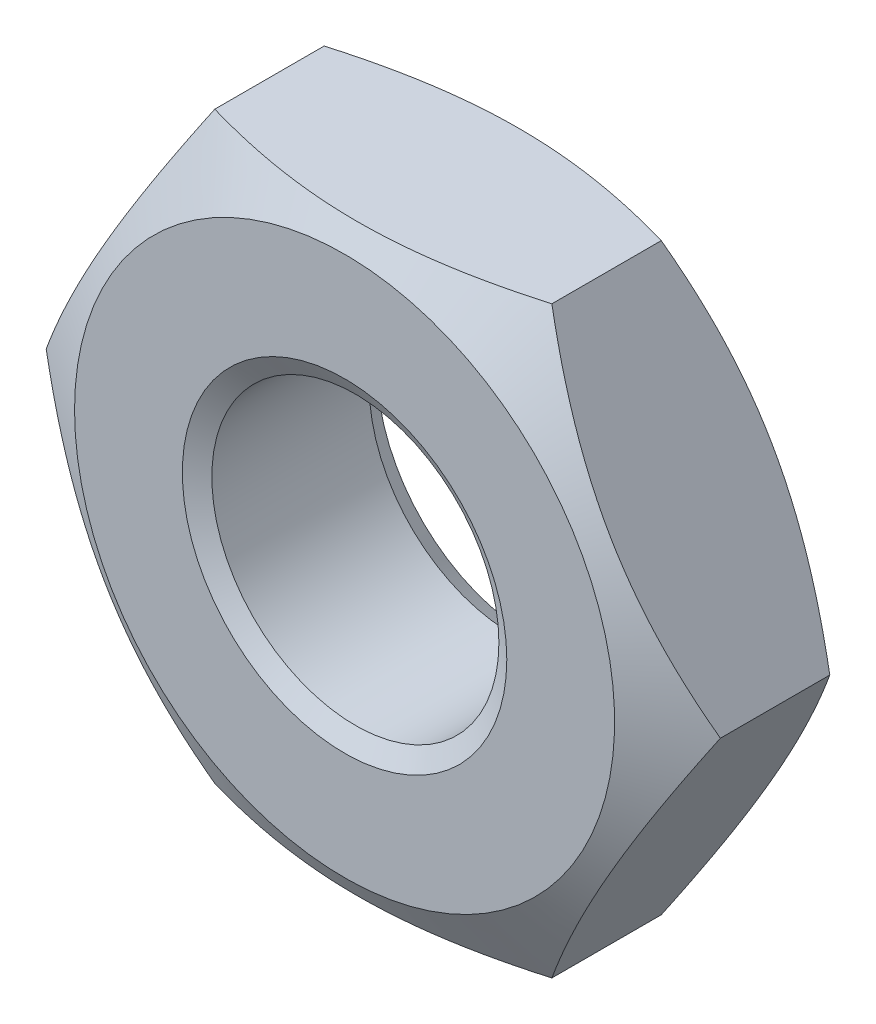
ISO-10303-21;
HEADER;
FILE_DESCRIPTION(('STEP AP214'),'2;1');
FILE_NAME('part.step','',(''),(''),'','','');
FILE_SCHEMA(('AUTOMOTIVE_DESIGN { 1 0 10303 214 1 1 1 1 }'));
ENDSEC;
DATA;
#1=APPLICATION_CONTEXT('core data for automotive mechanical design processes');
#2=APPLICATION_PROTOCOL_DEFINITION('international standard','automotive_design',2000,#1);
#3=PRODUCT_CONTEXT('',#1,'mechanical');
#4=PRODUCT('Part','Part','',(#3));
#5=PRODUCT_RELATED_PRODUCT_CATEGORY('part','',(#4));
#6=PRODUCT_DEFINITION_FORMATION('','',#4);
#7=PRODUCT_DEFINITION_CONTEXT('part definition',#1,'design');
#8=PRODUCT_DEFINITION('design','',#6,#7);
#9=PRODUCT_DEFINITION_SHAPE('','',#8);
#10=(LENGTH_UNIT() NAMED_UNIT(*) SI_UNIT(.MILLI.,.METRE.));
#11=(NAMED_UNIT(*) PLANE_ANGLE_UNIT() SI_UNIT($,.RADIAN.));
#12=(NAMED_UNIT(*) SI_UNIT($,.STERADIAN.) SOLID_ANGLE_UNIT());
#13=UNCERTAINTY_MEASURE_WITH_UNIT(LENGTH_MEASURE(1.E-05),#10,'distance_accuracy_value','');
#14=(GEOMETRIC_REPRESENTATION_CONTEXT(3) GLOBAL_UNCERTAINTY_ASSIGNED_CONTEXT((#13)) GLOBAL_UNIT_ASSIGNED_CONTEXT((#10,
#11,#12)) REPRESENTATION_CONTEXT('',''));
#15=CARTESIAN_POINT('',(0.,0.,0.));
#16=DIRECTION('',(0.,0.,1.));
#17=DIRECTION('',(1.,0.,0.));
#18=AXIS2_PLACEMENT_3D('',#15,#16,#17);
#19=CARTESIAN_POINT('',(-2.88675134594813,-5.,-3.2));
#20=DIRECTION('',(0.,-1.,0.));
#21=DIRECTION('',(0.,0.,-1.));
#22=AXIS2_PLACEMENT_3D('',#19,#20,#21);
#23=PLANE('',#22);
#24=CARTESIAN_POINT('',(-7.62610109642657,-5.,-2.59465189961733));
#25=CARTESIAN_POINT('',(-7.40680462387157,-5.,-2.48880064655454));
#26=CARTESIAN_POINT('',(-7.18698625319056,-5.,-2.38401087554829));
#27=CARTESIAN_POINT('',(-6.74602337963763,-5.,-2.17716157604716));
#28=CARTESIAN_POINT('',(-6.5248786519794,-5.,-2.07510252732497));
#29=CARTESIAN_POINT('',(-6.07977122145086,-5.,-1.87377772298819));
#30=CARTESIAN_POINT('',(-5.85579961499066,-5.,-1.7745315804738));
#31=CARTESIAN_POINT('',(-5.40600442176888,-5.,-1.58034558991326));
#32=CARTESIAN_POINT('',(-5.18018093332123,-5.,-1.48540551498912));
#33=CARTESIAN_POINT('',(-4.72365957742319,-5.,-1.29990810802235));
#34=CARTESIAN_POINT('',(-4.49293557407722,-5.,-1.20941474238578));
#35=CARTESIAN_POINT('',(-4.0287555357453,-5.,-1.03559062317218));
#36=CARTESIAN_POINT('',(-3.79529919900584,-5.,-0.952260669352543));
#37=CARTESIAN_POINT('',(-3.32577267957494,-5.,-0.795024367942579));
#38=CARTESIAN_POINT('',(-3.08970936568518,-5.,-0.72109772056705));
#39=CARTESIAN_POINT('',(-2.61422832862103,-5.,-0.585088280679049));
#40=CARTESIAN_POINT('',(-2.37481170005248,-5.,-0.523001715725235));
#41=CARTESIAN_POINT('',(-1.8924485677613,-5.,-0.413702737543139));
#42=CARTESIAN_POINT('',(-1.64950078161835,-5.,-0.366495876945354));
#43=CARTESIAN_POINT('',(-1.16070996598629,-5.,-0.29016024394961));
#44=CARTESIAN_POINT('',(-0.914866928294789,-5.,-0.261031522780502));
#45=CARTESIAN_POINT('',(-0.423107003526087,-5.,-0.223429734101214));
#46=CARTESIAN_POINT('',(-0.17720012837845,-5.,-0.21482904798375));
#47=CARTESIAN_POINT('',(0.314391860281712,-5.,-0.218726959851281));
#48=CARTESIAN_POINT('',(0.560077014096603,-5.,-0.231220233916041));
#49=CARTESIAN_POINT('',(0.98046823291688,-5.,-0.26977191210304));
#50=CARTESIAN_POINT('',(1.15564068945729,-5.,-0.291007824000625));
#51=CARTESIAN_POINT('',(1.50461161321748,-5.,-0.342806673261787));
#52=CARTESIAN_POINT('',(1.67840986865902,-5.,-0.373371020558309));
#53=CARTESIAN_POINT('',(2.19802325603685,-5.,-0.477533886990483));
#54=CARTESIAN_POINT('',(2.54137550131329,-5.,-0.563531808073422));
#55=CARTESIAN_POINT('',(3.05491771823626,-5.,-0.711561468799111));
#56=CARTESIAN_POINT('',(3.22779534181989,-5.,-0.764790949484559));
#57=CARTESIAN_POINT('',(3.57188016810636,-5.,-0.876495029428237));
#58=CARTESIAN_POINT('',(3.74308721989283,-5.,-0.934970097787195));
#59=CARTESIAN_POINT('',(4.08297609926363,-5.,-1.05591692981487));
#60=CARTESIAN_POINT('',(4.2516667366709,-5.,-1.11836418481148));
#61=CARTESIAN_POINT('',(4.58761682064633,-5.,-1.24683492900998));
#62=CARTESIAN_POINT('',(4.75487673996794,-5.,-1.3128571795353));
#63=CARTESIAN_POINT('',(4.92153493264753,-5.,-1.38033134642848));
#64=B_SPLINE_CURVE_WITH_KNOTS('',3,(#24,#25,#26,#27,#28,#29,#30,#31,#32,#33,#34,#35,#36,#37,#38,
#39,#40,#41,#42,#43,#44,#45,#46,#47,#48,#49,#50,#51,#52,#53,#54,#55,#56,#57,#58,#59,#60,#61,#62,
#63),.UNSPECIFIED.,.F.,.F.,(4,2,2,2,2,2,2,2,2,2,2,2,2,2,2,2,2,2,2,4),(0.,0.73052956672456,
1.46118665165218,2.19607764026717,2.93092986387477,3.67434556130395,4.41784414969813,
5.15970940795047,5.90133789959201,6.64324281655146,7.38514983587115,8.12243241795256,
8.85952894455192,9.38863514952208,9.9178213651246,10.9782399869672,11.5208585190153,
12.0635256246456,12.6031195929073,13.1425277824729),.UNSPECIFIED.);
#65=CARTESIAN_POINT('',(-2.88675134594813,-5.00000000000001,-0.663088338331307));
#66=VERTEX_POINT('',#65);
#67=CARTESIAN_POINT('',(2.88675134594813,-5.,-0.663088338331307));
#68=VERTEX_POINT('',#67);
#69=EDGE_CURVE('E50',#66,#68,#64,.T.);
#70=ORIENTED_EDGE('',*,*,#69,.F.);
#71=DIRECTION('',(0.,0.,1.));
#72=VECTOR('',#71,1.);
#73=CARTESIAN_POINT('',(-2.88675134594813,-5.,-3.2));
#74=LINE('',#73,#72);
#75=CARTESIAN_POINT('',(-2.88675134594813,-5.00000000000001,-2.53691166166869));
#76=VERTEX_POINT('',#75);
#77=EDGE_CURVE('E105',#76,#66,#74,.T.);
#78=ORIENTED_EDGE('',*,*,#77,.F.);
#79=CARTESIAN_POINT('',(-7.62610109642657,-5.,-0.60534810038267));
#80=CARTESIAN_POINT('',(-7.40680462387157,-5.,-0.71119935344546));
#81=CARTESIAN_POINT('',(-7.18698625319056,-5.,-0.81598912445171));
#82=CARTESIAN_POINT('',(-6.74602337963764,-5.,-1.02283842395284));
#83=CARTESIAN_POINT('',(-6.5248786519794,-5.,-1.12489747267503));
#84=CARTESIAN_POINT('',(-6.07977122145087,-5.,-1.32622227701181));
#85=CARTESIAN_POINT('',(-5.85579961499066,-5.,-1.4254684195262));
#86=CARTESIAN_POINT('',(-5.40600442176889,-5.,-1.61965441008674));
#87=CARTESIAN_POINT('',(-5.18018093332123,-5.,-1.71459448501088));
#88=CARTESIAN_POINT('',(-4.7236595774232,-5.,-1.90009189197765));
#89=CARTESIAN_POINT('',(-4.49293557407722,-5.,-1.99058525761422));
#90=CARTESIAN_POINT('',(-4.02875553574531,-5.,-2.16440937682782));
#91=CARTESIAN_POINT('',(-3.79529919900584,-5.,-2.24773933064746));
#92=CARTESIAN_POINT('',(-3.32577267957494,-5.,-2.40497563205742));
#93=CARTESIAN_POINT('',(-3.08970936568518,-5.,-2.47890227943295));
#94=CARTESIAN_POINT('',(-2.61422832862103,-5.,-2.61491171932095));
#95=CARTESIAN_POINT('',(-2.37481170005248,-5.,-2.67699828427477));
#96=CARTESIAN_POINT('',(-1.8924485677613,-5.,-2.78629726245686));
#97=CARTESIAN_POINT('',(-1.64950078161835,-5.,-2.83350412305465));
#98=CARTESIAN_POINT('',(-1.16070996598629,-5.,-2.90983975605039));
#99=CARTESIAN_POINT('',(-0.914866928294789,-5.,-2.9389684772195));
#100=CARTESIAN_POINT('',(-0.423107003526086,-5.,-2.97657026589879));
#101=CARTESIAN_POINT('',(-0.17720012837845,-5.,-2.98517095201625));
#102=CARTESIAN_POINT('',(0.314391860281713,-5.,-2.98127304014872));
#103=CARTESIAN_POINT('',(0.560077014096603,-5.,-2.96877976608396));
#104=CARTESIAN_POINT('',(0.98046823291688,-5.,-2.93022808789696));
#105=CARTESIAN_POINT('',(1.15564068945728,-5.,-2.90899217599938));
#106=CARTESIAN_POINT('',(1.50461161321748,-5.,-2.85719332673821));
#107=CARTESIAN_POINT('',(1.67840986865902,-5.,-2.82662897944169));
#108=CARTESIAN_POINT('',(2.19802325603684,-5.,-2.72246611300952));
#109=CARTESIAN_POINT('',(2.54137550131329,-5.,-2.63646819192658));
#110=CARTESIAN_POINT('',(3.05491771823626,-5.,-2.48843853120089));
#111=CARTESIAN_POINT('',(3.22779534181988,-5.,-2.43520905051544));
#112=CARTESIAN_POINT('',(3.57188016810636,-5.,-2.32350497057176));
#113=CARTESIAN_POINT('',(3.74308721989283,-5.,-2.26502990221281));
#114=CARTESIAN_POINT('',(4.08297609926363,-5.,-2.14408307018513));
#115=CARTESIAN_POINT('',(4.2516667366709,-5.,-2.08163581518852));
#116=CARTESIAN_POINT('',(4.58761682064633,-5.,-1.95316507099002));
#117=CARTESIAN_POINT('',(4.75487673996794,-5.,-1.8871428204647));
#118=CARTESIAN_POINT('',(4.92153493264753,-5.,-1.81966865357152));
#119=B_SPLINE_CURVE_WITH_KNOTS('',3,(#79,#80,#81,#82,#83,#84,#85,#86,#87,#88,#89,#90,#91,#92,
#93,#94,#95,#96,#97,#98,#99,#100,#101,#102,#103,#104,#105,#106,#107,#108,#109,#110,#111,#112,
#113,#114,#115,#116,#117,#118),.UNSPECIFIED.,.F.,.F.,(4,2,2,2,2,2,2,2,2,2,2,2,2,2,2,2,2,2,2,4),
(0.,0.730529566724558,1.46118665165218,2.19607764026716,2.93092986387477,3.67434556130395,
4.41784414969813,5.15970940795047,5.90133789959201,6.64324281655146,7.38514983587115,
8.12243241795256,8.85952894455192,9.38863514952208,9.9178213651246,10.9782399869672,
11.5208585190152,12.0635256246456,12.6031195929073,13.1425277824729),.UNSPECIFIED.);
#120=CARTESIAN_POINT('',(2.88675134594813,-5.00000000000001,-2.53691166166869));
#121=VERTEX_POINT('',#120);
#122=EDGE_CURVE('E126',#121,#76,#119,.F.);
#123=ORIENTED_EDGE('',*,*,#122,.F.);
#124=DIRECTION('',(0.,0.,1.));
#125=VECTOR('',#124,1.);
#126=CARTESIAN_POINT('',(2.88675134594813,-5.,-3.2));
#127=LINE('',#126,#125);
#128=EDGE_CURVE('E123',#121,#68,#127,.T.);
#129=ORIENTED_EDGE('',*,*,#128,.T.);
#130=EDGE_LOOP('',(#70,#78,#123,#129));
#131=FACE_BOUND('',#130,.T.);
#132=ADVANCED_FACE('F35',(#131),#23,.T.);
#133=CARTESIAN_POINT('',(-5.77350269189626,0.,-3.2));
#134=DIRECTION('',(-0.866025403784438,-0.5,0.));
#135=DIRECTION('',(0.5,-0.866025403784438,0.));
#136=AXIS2_PLACEMENT_3D('',#133,#134,#135);
#137=PLANE('',#136);
#138=CARTESIAN_POINT('',(-5.7736181619501,0.000200000000000997,-0.663155006997934));
#139=CARTESIAN_POINT('',(-5.64675433465071,-0.219534594525183,-0.589892918583741));
#140=CARTESIAN_POINT('',(-5.5188054379059,-0.441148584459579,-0.523257672864198));
#141=CARTESIAN_POINT('',(-5.26069210252318,-0.888213995453511,-0.406945341956918));
#142=CARTESIAN_POINT('',(-5.13052307794721,-1.11367335959077,-0.357309400861896));
#143=CARTESIAN_POINT('',(-4.87177839004641,-1.56183230522351,-0.280057376364806));
#144=CARTESIAN_POINT('',(-4.74324302208387,-1.78446209310419,-0.251926729229598));
#145=CARTESIAN_POINT('',(-4.54998783160116,-2.11918990184664,-0.226701272899793));
#146=CARTESIAN_POINT('',(-4.48552534905128,-2.23084219680506,-0.221119810715592));
#147=CARTESIAN_POINT('',(-4.35654081066911,-2.4542499706738,-0.215708567697578));
#148=CARTESIAN_POINT('',(-4.2920187567385,-2.56600544629031,-0.215878609204312));
#149=CARTESIAN_POINT('',(-4.11524635305245,-2.87218423085064,-0.224259982738145));
#150=CARTESIAN_POINT('',(-4.00305457769146,-3.06650608596721,-0.23833612284336));
#151=CARTESIAN_POINT('',(-3.77941563226458,-3.4538601019977,-0.282971608055538));
#152=CARTESIAN_POINT('',(-3.66796924828419,-3.64689090137157,-0.313546211093615));
#153=CARTESIAN_POINT('',(-3.44387972423144,-4.03502534247485,-0.389974844567269));
#154=CARTESIAN_POINT('',(-3.3312648659868,-4.23007999864173,-0.436152729824785));
#155=CARTESIAN_POINT('',(-3.10771464157941,-4.61728034535877,-0.540958145438038));
#156=CARTESIAN_POINT('',(-2.99677641204847,-4.80943099540808,-0.599561054383478));
#157=CARTESIAN_POINT('',(-2.88663587589429,-5.0002,-0.663155006997931));
#158=B_SPLINE_CURVE_WITH_KNOTS('',3,(#138,#139,#140,#141,#142,#143,#144,#145,#146,#147,#148,
#149,#150,#151,#152,#153,#154,#155,#156,#157),.UNSPECIFIED.,.F.,.F.,(4,2,2,2,2,2,2,2,2,4),(0.,
0.79255584136309,1.58701660053333,2.3618153748728,2.74884076077325,3.13585419177295,
3.80962362599679,4.48401723901189,5.17336882348928,5.86136694793725),.UNSPECIFIED.);
#159=CARTESIAN_POINT('',(-5.77350269189626,0.,-0.663088338331307));
#160=VERTEX_POINT('',#159);
#161=EDGE_CURVE('E90',#160,#66,#158,.T.);
#162=ORIENTED_EDGE('',*,*,#161,.F.);
#163=DIRECTION('',(0.,0.,1.));
#164=VECTOR('',#163,1.);
#165=CARTESIAN_POINT('',(-5.77350269189626,0.,-3.2));
#166=LINE('',#165,#164);
#167=CARTESIAN_POINT('',(-5.77350269189626,0.,-2.53691166166869));
#168=VERTEX_POINT('',#167);
#169=EDGE_CURVE('E103',#168,#160,#166,.T.);
#170=ORIENTED_EDGE('',*,*,#169,.F.);
#171=CARTESIAN_POINT('',(-2.88663587589429,-5.0002,-2.53684499300207));
#172=CARTESIAN_POINT('',(-3.01349970319368,-4.78046540547481,-2.61010708141626));
#173=CARTESIAN_POINT('',(-3.14144859993849,-4.55885141554042,-2.6767423271358));
#174=CARTESIAN_POINT('',(-3.39956193532121,-4.11178600454649,-2.79305465804308));
#175=CARTESIAN_POINT('',(-3.52973095989718,-3.88632664040922,-2.84269059913811));
#176=CARTESIAN_POINT('',(-3.78847564779798,-3.43816769477649,-2.9199426236352));
#177=CARTESIAN_POINT('',(-3.91701101576052,-3.21553790689581,-2.9480732707704));
#178=CARTESIAN_POINT('',(-4.11026620624323,-2.88081009815336,-2.97329872710021));
#179=CARTESIAN_POINT('',(-4.17472868879311,-2.76915780319494,-2.97888018928441));
#180=CARTESIAN_POINT('',(-4.30371322717528,-2.5457500293262,-2.98429143230242));
#181=CARTESIAN_POINT('',(-4.36823528110589,-2.43399455370969,-2.98412139079569));
#182=CARTESIAN_POINT('',(-4.54500768479194,-2.12781576914936,-2.97574001726186));
#183=CARTESIAN_POINT('',(-4.65719946015293,-1.93349391403279,-2.96166387715664));
#184=CARTESIAN_POINT('',(-4.88083840557981,-1.54613989800229,-2.91702839194446));
#185=CARTESIAN_POINT('',(-4.9922847895602,-1.35310909862843,-2.88645378890638));
#186=CARTESIAN_POINT('',(-5.21637431361295,-0.964974657525145,-2.81002515543273));
#187=CARTESIAN_POINT('',(-5.32898917185759,-0.769920001358264,-2.76384727017521));
#188=CARTESIAN_POINT('',(-5.55253939626498,-0.382719654641231,-2.65904185456196));
#189=CARTESIAN_POINT('',(-5.66347762579592,-0.190569004591912,-2.60043894561652));
#190=CARTESIAN_POINT('',(-5.7736181619501,0.000200000000000449,-2.53684499300207));
#191=B_SPLINE_CURVE_WITH_KNOTS('',3,(#171,#172,#173,#174,#175,#176,#177,#178,#179,#180,#181,
#182,#183,#184,#185,#186,#187,#188,#189,#190),.UNSPECIFIED.,.F.,.F.,(4,2,2,2,2,2,2,2,2,4),(0.,
0.79255584136309,1.58701660053333,2.3618153748728,2.74884076077325,3.13585419177295,
3.80962362599679,4.48401723901189,5.17336882348928,5.86136694793725),.UNSPECIFIED.);
#192=EDGE_CURVE('E199',#76,#168,#191,.T.);
#193=ORIENTED_EDGE('',*,*,#192,.F.);
#194=ORIENTED_EDGE('',*,*,#77,.T.);
#195=EDGE_LOOP('',(#162,#170,#193,#194));
#196=FACE_BOUND('',#195,.T.);
#197=ADVANCED_FACE('F101',(#196),#137,.T.);
#198=CARTESIAN_POINT('',(-2.88675134594813,5.,-3.2));
#199=DIRECTION('',(-0.866025403784439,0.5,0.));
#200=DIRECTION('',(-0.5,-0.866025403784439,0.));
#201=AXIS2_PLACEMENT_3D('',#198,#199,#200);
#202=PLANE('',#201);
#203=CARTESIAN_POINT('',(-2.88663587589429,5.0002,-0.663155006997933));
#204=CARTESIAN_POINT('',(-3.01349970319368,4.78046540547482,-0.589892918583739));
#205=CARTESIAN_POINT('',(-3.14144859993849,4.55885141554042,-0.523257672864197));
#206=CARTESIAN_POINT('',(-3.39956193532121,4.11178600454649,-0.406945341956917));
#207=CARTESIAN_POINT('',(-3.52973095989718,3.88632664040923,-0.357309400861896));
#208=CARTESIAN_POINT('',(-3.78847564779798,3.43816769477649,-0.280057376364806));
#209=CARTESIAN_POINT('',(-3.91701101576052,3.21553790689581,-0.251926729229598));
#210=CARTESIAN_POINT('',(-4.11026620624323,2.88081009815336,-0.226701272899793));
#211=CARTESIAN_POINT('',(-4.17472868879311,2.76915780319494,-0.221119810715593));
#212=CARTESIAN_POINT('',(-4.30371322717528,2.54575002932621,-0.215708567697579));
#213=CARTESIAN_POINT('',(-4.36823528110589,2.43399455370969,-0.215878609204312));
#214=CARTESIAN_POINT('',(-4.54500768479195,2.12781576914936,-0.224259982738146));
#215=CARTESIAN_POINT('',(-4.65719946015293,1.93349391403279,-0.23833612284336));
#216=CARTESIAN_POINT('',(-4.88083840557981,1.5461398980023,-0.282971608055539));
#217=CARTESIAN_POINT('',(-4.9922847895602,1.35310909862843,-0.313546211093616));
#218=CARTESIAN_POINT('',(-5.21637431361295,0.964974657525147,-0.389974844567271));
#219=CARTESIAN_POINT('',(-5.32898917185759,0.769920001358265,-0.436152729824787));
#220=CARTESIAN_POINT('',(-5.55253939626498,0.382719654641232,-0.540958145438041));
#221=CARTESIAN_POINT('',(-5.66347762579592,0.190569004591914,-0.59956105438348));
#222=CARTESIAN_POINT('',(-5.7736181619501,-0.00019999999999878,-0.663155006997934));
#223=B_SPLINE_CURVE_WITH_KNOTS('',3,(#203,#204,#205,#206,#207,#208,#209,#210,#211,#212,#213,
#214,#215,#216,#217,#218,#219,#220,#221,#222),.UNSPECIFIED.,.F.,.F.,(4,2,2,2,2,2,2,2,2,4),(0.,
0.79255584136309,1.58701660053333,2.3618153748728,2.74884076077325,3.13585419177295,
3.80962362599679,4.48401723901189,5.17336882348928,5.86136694793725),.UNSPECIFIED.);
#224=CARTESIAN_POINT('',(-2.88675134594814,5.,-0.663088338331307));
#225=VERTEX_POINT('',#224);
#226=EDGE_CURVE('E86',#225,#160,#223,.T.);
#227=ORIENTED_EDGE('',*,*,#226,.F.);
#228=DIRECTION('',(0.,0.,1.));
#229=VECTOR('',#228,1.);
#230=CARTESIAN_POINT('',(-2.88675134594813,5.,-3.2));
#231=LINE('',#230,#229);
#232=CARTESIAN_POINT('',(-2.88675134594813,5.,-2.53691166166869));
#233=VERTEX_POINT('',#232);
#234=EDGE_CURVE('E110',#233,#225,#231,.T.);
#235=ORIENTED_EDGE('',*,*,#234,.F.);
#236=CARTESIAN_POINT('',(-5.7736181619501,-0.000199999999999041,-2.53684499300207));
#237=CARTESIAN_POINT('',(-5.64675433465071,0.219534594525186,-2.61010708141626));
#238=CARTESIAN_POINT('',(-5.5188054379059,0.441148584459581,-2.6767423271358));
#239=CARTESIAN_POINT('',(-5.26069210252318,0.888213995453514,-2.79305465804308));
#240=CARTESIAN_POINT('',(-5.13052307794721,1.11367335959077,-2.8426905991381));
#241=CARTESIAN_POINT('',(-4.87177839004641,1.56183230522351,-2.91994262363519));
#242=CARTESIAN_POINT('',(-4.74324302208387,1.78446209310419,-2.9480732707704));
#243=CARTESIAN_POINT('',(-4.54998783160116,2.11918990184664,-2.97329872710021));
#244=CARTESIAN_POINT('',(-4.48552534905128,2.23084219680506,-2.97888018928441));
#245=CARTESIAN_POINT('',(-4.35654081066911,2.4542499706738,-2.98429143230242));
#246=CARTESIAN_POINT('',(-4.2920187567385,2.56600544629031,-2.98412139079569));
#247=CARTESIAN_POINT('',(-4.11524635305245,2.87218423085064,-2.97574001726186));
#248=CARTESIAN_POINT('',(-4.00305457769146,3.06650608596721,-2.96166387715664));
#249=CARTESIAN_POINT('',(-3.77941563226458,3.45386010199771,-2.91702839194446));
#250=CARTESIAN_POINT('',(-3.66796924828419,3.64689090137157,-2.88645378890638));
#251=CARTESIAN_POINT('',(-3.44387972423144,4.03502534247485,-2.81002515543273));
#252=CARTESIAN_POINT('',(-3.3312648659868,4.23007999864174,-2.76384727017521));
#253=CARTESIAN_POINT('',(-3.10771464157941,4.61728034535877,-2.65904185456196));
#254=CARTESIAN_POINT('',(-2.99677641204847,4.80943099540809,-2.60043894561652));
#255=CARTESIAN_POINT('',(-2.88663587589429,5.0002,-2.53684499300207));
#256=B_SPLINE_CURVE_WITH_KNOTS('',3,(#236,#237,#238,#239,#240,#241,#242,#243,#244,#245,#246,
#247,#248,#249,#250,#251,#252,#253,#254,#255),.UNSPECIFIED.,.F.,.F.,(4,2,2,2,2,2,2,2,2,4),(0.,
0.79255584136309,1.58701660053333,2.3618153748728,2.74884076077325,3.13585419177295,
3.80962362599679,4.48401723901189,5.17336882348928,5.86136694793725),.UNSPECIFIED.);
#257=EDGE_CURVE('E109',#168,#233,#256,.T.);
#258=ORIENTED_EDGE('',*,*,#257,.F.);
#259=ORIENTED_EDGE('',*,*,#169,.T.);
#260=EDGE_LOOP('',(#227,#235,#258,#259));
#261=FACE_BOUND('',#260,.T.);
#262=ADVANCED_FACE('F108',(#261),#202,.T.);
#263=CARTESIAN_POINT('',(2.88675134594812,5.,-3.2));
#264=DIRECTION('',(0.,1.,0.));
#265=DIRECTION('',(-1.,0.,0.));
#266=AXIS2_PLACEMENT_3D('',#263,#264,#265);
#267=PLANE('',#266);
#268=CARTESIAN_POINT('',(-7.62610109642657,5.,-2.59465189961733));
#269=CARTESIAN_POINT('',(-7.40680462387157,5.,-2.48880064655454));
#270=CARTESIAN_POINT('',(-7.18698625319057,5.,-2.38401087554829));
#271=CARTESIAN_POINT('',(-6.74602337963764,5.,-2.17716157604716));
#272=CARTESIAN_POINT('',(-6.5248786519794,5.,-2.07510252732498));
#273=CARTESIAN_POINT('',(-6.07977122145087,5.,-1.87377772298819));
#274=CARTESIAN_POINT('',(-5.85579961499066,5.,-1.7745315804738));
#275=CARTESIAN_POINT('',(-5.40600442176888,5.,-1.58034558991326));
#276=CARTESIAN_POINT('',(-5.18018093332123,5.,-1.48540551498912));
#277=CARTESIAN_POINT('',(-4.7236595774232,5.,-1.29990810802235));
#278=CARTESIAN_POINT('',(-4.49293557407722,5.,-1.20941474238578));
#279=CARTESIAN_POINT('',(-4.0287555357453,5.,-1.03559062317218));
#280=CARTESIAN_POINT('',(-3.79529919900584,5.,-0.952260669352544));
#281=CARTESIAN_POINT('',(-3.32577267957493,5.,-0.79502436794258));
#282=CARTESIAN_POINT('',(-3.08970936568518,5.,-0.721097720567052));
#283=CARTESIAN_POINT('',(-2.61422832862103,5.,-0.58508828067905));
#284=CARTESIAN_POINT('',(-2.37481170005248,5.,-0.523001715725236));
#285=CARTESIAN_POINT('',(-1.8924485677613,5.,-0.41370273754314));
#286=CARTESIAN_POINT('',(-1.64950078161835,5.,-0.366495876945355));
#287=CARTESIAN_POINT('',(-1.16070996598629,5.,-0.290160243949612));
#288=CARTESIAN_POINT('',(-0.914866928294789,5.,-0.261031522780504));
#289=CARTESIAN_POINT('',(-0.423107003526086,5.,-0.223429734101215));
#290=CARTESIAN_POINT('',(-0.17720012837845,5.,-0.214829047983752));
#291=CARTESIAN_POINT('',(0.314391860281713,5.,-0.218726959851283));
#292=CARTESIAN_POINT('',(0.560077014096604,5.,-0.231220233916043));
#293=CARTESIAN_POINT('',(0.980468232916881,5.,-0.269771912103042));
#294=CARTESIAN_POINT('',(1.15564068945729,5.,-0.291007824000627));
#295=CARTESIAN_POINT('',(1.50461161321748,5.,-0.342806673261789));
#296=CARTESIAN_POINT('',(1.67840986865903,5.,-0.373371020558311));
#297=CARTESIAN_POINT('',(2.19802325603685,5.,-0.477533886990485));
#298=CARTESIAN_POINT('',(2.54137550131329,5.,-0.563531808073424));
#299=CARTESIAN_POINT('',(3.05491771823626,5.,-0.711561468799113));
#300=CARTESIAN_POINT('',(3.22779534181989,5.,-0.764790949484561));
#301=CARTESIAN_POINT('',(3.57188016810636,5.,-0.876495029428238));
#302=CARTESIAN_POINT('',(3.74308721989283,5.,-0.934970097787197));
#303=CARTESIAN_POINT('',(4.08297609926364,5.,-1.05591692981487));
#304=CARTESIAN_POINT('',(4.25166673667091,5.,-1.11836418481148));
#305=CARTESIAN_POINT('',(4.58761682064634,5.,-1.24683492900998));
#306=CARTESIAN_POINT('',(4.75487673996795,5.,-1.3128571795353));
#307=CARTESIAN_POINT('',(4.92153493264753,5.,-1.38033134642848));
#308=B_SPLINE_CURVE_WITH_KNOTS('',3,(#268,#269,#270,#271,#272,#273,#274,#275,#276,#277,#278,
#279,#280,#281,#282,#283,#284,#285,#286,#287,#288,#289,#290,#291,#292,#293,#294,#295,#296,#297,
#298,#299,#300,#301,#302,#303,#304,#305,#306,#307),.UNSPECIFIED.,.F.,.F.,(4,2,2,2,2,2,2,2,2,2,2,
2,2,2,2,2,2,2,2,4),(0.,0.730529566724559,1.46118665165218,2.19607764026717,2.93092986387477,
3.67434556130396,4.41784414969813,5.15970940795047,5.90133789959201,6.64324281655146,
7.38514983587115,8.12243241795256,8.85952894455193,9.38863514952208,9.9178213651246,
10.9782399869672,11.5208585190153,12.0635256246456,12.6031195929073,13.1425277824729),.UNSPECIFIED.);
#309=CARTESIAN_POINT('',(2.88675134594812,5.00000000000001,-0.663088338331307));
#310=VERTEX_POINT('',#309);
#311=EDGE_CURVE('E92',#310,#225,#308,.F.);
#312=ORIENTED_EDGE('',*,*,#311,.F.);
#313=DIRECTION('',(0.,0.,1.));
#314=VECTOR('',#313,1.);
#315=CARTESIAN_POINT('',(2.88675134594812,5.,-3.2));
#316=LINE('',#315,#314);
#317=CARTESIAN_POINT('',(2.88675134594812,5.00000000000001,-2.53691166166869));
#318=VERTEX_POINT('',#317);
#319=EDGE_CURVE('E114',#318,#310,#316,.T.);
#320=ORIENTED_EDGE('',*,*,#319,.F.);
#321=CARTESIAN_POINT('',(-7.62610109642657,5.,-0.605348100382668));
#322=CARTESIAN_POINT('',(-7.40680462387157,5.,-0.711199353445458));
#323=CARTESIAN_POINT('',(-7.18698625319057,5.,-0.815989124451708));
#324=CARTESIAN_POINT('',(-6.74602337963764,5.,-1.02283842395284));
#325=CARTESIAN_POINT('',(-6.5248786519794,5.,-1.12489747267502));
#326=CARTESIAN_POINT('',(-6.07977122145087,5.,-1.32622227701181));
#327=CARTESIAN_POINT('',(-5.85579961499066,5.,-1.4254684195262));
#328=CARTESIAN_POINT('',(-5.40600442176888,5.,-1.61965441008674));
#329=CARTESIAN_POINT('',(-5.18018093332123,5.,-1.71459448501088));
#330=CARTESIAN_POINT('',(-4.7236595774232,5.,-1.90009189197765));
#331=CARTESIAN_POINT('',(-4.49293557407722,5.,-1.99058525761422));
#332=CARTESIAN_POINT('',(-4.0287555357453,5.,-2.16440937682782));
#333=CARTESIAN_POINT('',(-3.79529919900584,5.,-2.24773933064746));
#334=CARTESIAN_POINT('',(-3.32577267957493,5.,-2.40497563205742));
#335=CARTESIAN_POINT('',(-3.08970936568518,5.,-2.47890227943295));
#336=CARTESIAN_POINT('',(-2.61422832862103,5.,-2.61491171932095));
#337=CARTESIAN_POINT('',(-2.37481170005248,5.,-2.67699828427476));
#338=CARTESIAN_POINT('',(-1.8924485677613,5.,-2.78629726245686));
#339=CARTESIAN_POINT('',(-1.64950078161835,5.,-2.83350412305465));
#340=CARTESIAN_POINT('',(-1.16070996598629,5.,-2.90983975605039));
#341=CARTESIAN_POINT('',(-0.91486692829479,5.,-2.9389684772195));
#342=CARTESIAN_POINT('',(-0.423107003526086,5.,-2.97657026589878));
#343=CARTESIAN_POINT('',(-0.17720012837845,5.,-2.98517095201625));
#344=CARTESIAN_POINT('',(0.314391860281713,5.,-2.98127304014872));
#345=CARTESIAN_POINT('',(0.560077014096604,5.,-2.96877976608396));
#346=CARTESIAN_POINT('',(0.980468232916881,5.,-2.93022808789696));
#347=CARTESIAN_POINT('',(1.15564068945729,5.,-2.90899217599937));
#348=CARTESIAN_POINT('',(1.50461161321748,5.,-2.85719332673821));
#349=CARTESIAN_POINT('',(1.67840986865903,5.,-2.82662897944169));
#350=CARTESIAN_POINT('',(2.19802325603685,5.,-2.72246611300951));
#351=CARTESIAN_POINT('',(2.54137550131329,5.,-2.63646819192658));
#352=CARTESIAN_POINT('',(3.05491771823626,5.,-2.48843853120089));
#353=CARTESIAN_POINT('',(3.22779534181989,5.,-2.43520905051544));
#354=CARTESIAN_POINT('',(3.57188016810636,5.,-2.32350497057176));
#355=CARTESIAN_POINT('',(3.74308721989283,5.,-2.2650299022128));
#356=CARTESIAN_POINT('',(4.08297609926364,5.,-2.14408307018513));
#357=CARTESIAN_POINT('',(4.25166673667091,5.,-2.08163581518852));
#358=CARTESIAN_POINT('',(4.58761682064634,5.,-1.95316507099002));
#359=CARTESIAN_POINT('',(4.75487673996795,5.,-1.8871428204647));
#360=CARTESIAN_POINT('',(4.92153493264753,5.,-1.81966865357152));
#361=B_SPLINE_CURVE_WITH_KNOTS('',3,(#321,#322,#323,#324,#325,#326,#327,#328,#329,#330,#331,
#332,#333,#334,#335,#336,#337,#338,#339,#340,#341,#342,#343,#344,#345,#346,#347,#348,#349,#350,
#351,#352,#353,#354,#355,#356,#357,#358,#359,#360),.UNSPECIFIED.,.F.,.F.,(4,2,2,2,2,2,2,2,2,2,2,
2,2,2,2,2,2,2,2,4),(0.,0.730529566724559,1.46118665165218,2.19607764026717,2.93092986387477,
3.67434556130396,4.41784414969813,5.15970940795048,5.90133789959201,6.64324281655146,
7.38514983587115,8.12243241795256,8.85952894455193,9.38863514952208,9.9178213651246,
10.9782399869672,11.5208585190153,12.0635256246456,12.6031195929073,13.1425277824729),.UNSPECIFIED.);
#362=EDGE_CURVE('E186',#233,#318,#361,.T.);
#363=ORIENTED_EDGE('',*,*,#362,.F.);
#364=ORIENTED_EDGE('',*,*,#234,.T.);
#365=EDGE_LOOP('',(#312,#320,#363,#364));
#366=FACE_BOUND('',#365,.T.);
#367=ADVANCED_FACE('F234',(#366),#267,.T.);
#368=CARTESIAN_POINT('',(5.77350269189626,0.,-3.2));
#369=DIRECTION('',(0.866025403784438,0.5,0.));
#370=DIRECTION('',(-0.5,0.866025403784439,0.));
#371=AXIS2_PLACEMENT_3D('',#368,#369,#370);
#372=PLANE('',#371);
#373=CARTESIAN_POINT('',(5.77361816195009,-0.000199999999999232,-0.663155006997931));
#374=CARTESIAN_POINT('',(5.6467543346507,0.219534594525185,-0.589892918583737));
#375=CARTESIAN_POINT('',(5.51880543790589,0.44114858445958,-0.523257672864195));
#376=CARTESIAN_POINT('',(5.26069210252318,0.888213995453513,-0.406945341956915));
#377=CARTESIAN_POINT('',(5.13052307794721,1.11367335959077,-0.357309400861894));
#378=CARTESIAN_POINT('',(4.87177839004641,1.56183230522351,-0.280057376364804));
#379=CARTESIAN_POINT('',(4.74324302208387,1.78446209310419,-0.251926729229595));
#380=CARTESIAN_POINT('',(4.54998783160116,2.11918990184664,-0.22670127289979));
#381=CARTESIAN_POINT('',(4.48552534905128,2.23084219680506,-0.22111981071559));
#382=CARTESIAN_POINT('',(4.35654081066911,2.45424997067379,-0.215708567697576));
#383=CARTESIAN_POINT('',(4.2920187567385,2.56600544629031,-0.215878609204309));
#384=CARTESIAN_POINT('',(4.11524635305244,2.87218423085064,-0.224259982738143));
#385=CARTESIAN_POINT('',(4.00305457769146,3.06650608596721,-0.238336122843358));
#386=CARTESIAN_POINT('',(3.77941563226457,3.4538601019977,-0.282971608055537));
#387=CARTESIAN_POINT('',(3.66796924828418,3.64689090137157,-0.313546211093613));
#388=CARTESIAN_POINT('',(3.44387972423144,4.03502534247485,-0.389974844567268));
#389=CARTESIAN_POINT('',(3.3312648659868,4.23007999864174,-0.436152729824784));
#390=CARTESIAN_POINT('',(3.1077146415794,4.61728034535877,-0.540958145438038));
#391=CARTESIAN_POINT('',(2.99677641204847,4.80943099540809,-0.599561054383477));
#392=CARTESIAN_POINT('',(2.88663587589429,5.0002,-0.663155006997931));
#393=B_SPLINE_CURVE_WITH_KNOTS('',3,(#373,#374,#375,#376,#377,#378,#379,#380,#381,#382,#383,
#384,#385,#386,#387,#388,#389,#390,#391,#392),.UNSPECIFIED.,.F.,.F.,(4,2,2,2,2,2,2,2,2,4),(0.,
0.792555841363089,1.58701660053333,2.3618153748728,2.74884076077325,3.13585419177294,
3.80962362599679,4.48401723901189,5.17336882348928,5.86136694793725),.UNSPECIFIED.);
#394=CARTESIAN_POINT('',(5.77350269189626,0.,-0.663088338331307));
#395=VERTEX_POINT('',#394);
#396=EDGE_CURVE('E228',#395,#310,#393,.T.);
#397=ORIENTED_EDGE('',*,*,#396,.F.);
#398=DIRECTION('',(0.,0.,1.));
#399=VECTOR('',#398,1.);
#400=CARTESIAN_POINT('',(5.77350269189626,0.,-3.2));
#401=LINE('',#400,#399);
#402=CARTESIAN_POINT('',(5.77350269189626,0.,-2.5369116616687));
#403=VERTEX_POINT('',#402);
#404=EDGE_CURVE('E120',#403,#395,#401,.T.);
#405=ORIENTED_EDGE('',*,*,#404,.F.);
#406=CARTESIAN_POINT('',(2.88663587589429,5.0002,-2.53684499300207));
#407=CARTESIAN_POINT('',(3.01349970319367,4.78046540547482,-2.61010708141626));
#408=CARTESIAN_POINT('',(3.14144859993849,4.55885141554042,-2.6767423271358));
#409=CARTESIAN_POINT('',(3.3995619353212,4.11178600454649,-2.79305465804308));
#410=CARTESIAN_POINT('',(3.52973095989717,3.88632664040923,-2.84269059913811));
#411=CARTESIAN_POINT('',(3.78847564779797,3.43816769477649,-2.9199426236352));
#412=CARTESIAN_POINT('',(3.91701101576051,3.21553790689581,-2.9480732707704));
#413=CARTESIAN_POINT('',(4.11026620624322,2.88081009815336,-2.97329872710021));
#414=CARTESIAN_POINT('',(4.1747286887931,2.76915780319494,-2.97888018928441));
#415=CARTESIAN_POINT('',(4.30371322717527,2.54575002932621,-2.98429143230242));
#416=CARTESIAN_POINT('',(4.36823528110588,2.43399455370969,-2.98412139079569));
#417=CARTESIAN_POINT('',(4.54500768479194,2.12781576914937,-2.97574001726186));
#418=CARTESIAN_POINT('',(4.65719946015292,1.93349391403279,-2.96166387715664));
#419=CARTESIAN_POINT('',(4.88083840557981,1.5461398980023,-2.91702839194446));
#420=CARTESIAN_POINT('',(4.9922847895602,1.35310909862843,-2.88645378890639));
#421=CARTESIAN_POINT('',(5.21637431361294,0.964974657525148,-2.81002515543273));
#422=CARTESIAN_POINT('',(5.32898917185758,0.769920001358266,-2.76384727017522));
#423=CARTESIAN_POINT('',(5.55253939626498,0.382719654641233,-2.65904185456196));
#424=CARTESIAN_POINT('',(5.66347762579591,0.190569004591914,-2.60043894561652));
#425=CARTESIAN_POINT('',(5.77361816195009,-0.000199999999998875,-2.53684499300207));
#426=B_SPLINE_CURVE_WITH_KNOTS('',3,(#406,#407,#408,#409,#410,#411,#412,#413,#414,#415,#416,
#417,#418,#419,#420,#421,#422,#423,#424,#425),.UNSPECIFIED.,.F.,.F.,(4,2,2,2,2,2,2,2,2,4),(0.,
0.792555841363089,1.58701660053333,2.3618153748728,2.74884076077325,3.13585419177295,
3.80962362599679,4.48401723901189,5.17336882348928,5.86136694793725),.UNSPECIFIED.);
#427=EDGE_CURVE('E58',#318,#403,#426,.T.);
#428=ORIENTED_EDGE('',*,*,#427,.F.);
#429=ORIENTED_EDGE('',*,*,#319,.T.);
#430=EDGE_LOOP('',(#397,#405,#428,#429));
#431=FACE_BOUND('',#430,.T.);
#432=ADVANCED_FACE('F237',(#431),#372,.T.);
#433=CARTESIAN_POINT('',(2.88675134594813,-5.,-3.2));
#434=DIRECTION('',(0.866025403784439,-0.5,0.));
#435=DIRECTION('',(0.5,0.866025403784439,0.));
#436=AXIS2_PLACEMENT_3D('',#433,#434,#435);
#437=PLANE('',#436);
#438=CARTESIAN_POINT('',(2.88663587589429,-5.0002,-0.663155006997931));
#439=CARTESIAN_POINT('',(3.01349970319368,-4.78046540547481,-0.589892918583738));
#440=CARTESIAN_POINT('',(3.14144859993849,-4.55885141554042,-0.523257672864196));
#441=CARTESIAN_POINT('',(3.39956193532121,-4.11178600454649,-0.406945341956915));
#442=CARTESIAN_POINT('',(3.52973095989718,-3.88632664040923,-0.357309400861894));
#443=CARTESIAN_POINT('',(3.78847564779797,-3.43816769477649,-0.280057376364804));
#444=CARTESIAN_POINT('',(3.91701101576052,-3.21553790689581,-0.251926729229596));
#445=CARTESIAN_POINT('',(4.11026620624322,-2.88081009815336,-0.226701272899791));
#446=CARTESIAN_POINT('',(4.17472868879311,-2.76915780319494,-0.22111981071559));
#447=CARTESIAN_POINT('',(4.30371322717528,-2.5457500293262,-0.215708567697576));
#448=CARTESIAN_POINT('',(4.36823528110588,-2.43399455370969,-0.21587860920431));
#449=CARTESIAN_POINT('',(4.54500768479194,-2.12781576914936,-0.224259982738143));
#450=CARTESIAN_POINT('',(4.65719946015292,-1.93349391403279,-0.238336122843358));
#451=CARTESIAN_POINT('',(4.88083840557981,-1.5461398980023,-0.282971608055536));
#452=CARTESIAN_POINT('',(4.9922847895602,-1.35310909862843,-0.313546211093613));
#453=CARTESIAN_POINT('',(5.21637431361294,-0.964974657525146,-0.389974844567268));
#454=CARTESIAN_POINT('',(5.32898917185758,-0.769920001358265,-0.436152729824784));
#455=CARTESIAN_POINT('',(5.55253939626498,-0.382719654641232,-0.540958145438037));
#456=CARTESIAN_POINT('',(5.66347762579591,-0.190569004591914,-0.599561054383477));
#457=CARTESIAN_POINT('',(5.77361816195009,0.000199999999999759,-0.66315500699793));
#458=B_SPLINE_CURVE_WITH_KNOTS('',3,(#438,#439,#440,#441,#442,#443,#444,#445,#446,#447,#448,
#449,#450,#451,#452,#453,#454,#455,#456,#457),.UNSPECIFIED.,.F.,.F.,(4,2,2,2,2,2,2,2,2,4),(0.,
0.792555841363089,1.58701660053333,2.3618153748728,2.74884076077325,3.13585419177295,
3.80962362599679,4.48401723901189,5.17336882348928,5.86136694793725),.UNSPECIFIED.);
#459=EDGE_CURVE('E258',#68,#395,#458,.T.);
#460=ORIENTED_EDGE('',*,*,#459,.F.);
#461=ORIENTED_EDGE('',*,*,#128,.F.);
#462=CARTESIAN_POINT('',(5.77361816195009,0.000200000000001023,-2.53684499300207));
#463=CARTESIAN_POINT('',(5.6467543346507,-0.219534594525184,-2.61010708141626));
#464=CARTESIAN_POINT('',(5.51880543790589,-0.441148584459579,-2.6767423271358));
#465=CARTESIAN_POINT('',(5.26069210252318,-0.888213995453512,-2.79305465804308));
#466=CARTESIAN_POINT('',(5.13052307794721,-1.11367335959077,-2.84269059913811));
#467=CARTESIAN_POINT('',(4.87177839004641,-1.56183230522351,-2.9199426236352));
#468=CARTESIAN_POINT('',(4.74324302208387,-1.78446209310419,-2.94807327077041));
#469=CARTESIAN_POINT('',(4.54998783160116,-2.11918990184664,-2.97329872710021));
#470=CARTESIAN_POINT('',(4.48552534905128,-2.23084219680506,-2.97888018928441));
#471=CARTESIAN_POINT('',(4.35654081066911,-2.45424997067379,-2.98429143230242));
#472=CARTESIAN_POINT('',(4.2920187567385,-2.56600544629031,-2.98412139079569));
#473=CARTESIAN_POINT('',(4.11524635305244,-2.87218423085063,-2.97574001726186));
#474=CARTESIAN_POINT('',(4.00305457769146,-3.06650608596721,-2.96166387715664));
#475=CARTESIAN_POINT('',(3.77941563226457,-3.4538601019977,-2.91702839194446));
#476=CARTESIAN_POINT('',(3.66796924828418,-3.64689090137157,-2.88645378890639));
#477=CARTESIAN_POINT('',(3.44387972423144,-4.03502534247485,-2.81002515543273));
#478=CARTESIAN_POINT('',(3.3312648659868,-4.23007999864173,-2.76384727017522));
#479=CARTESIAN_POINT('',(3.1077146415794,-4.61728034535877,-2.65904185456196));
#480=CARTESIAN_POINT('',(2.99677641204847,-4.80943099540808,-2.60043894561652));
#481=CARTESIAN_POINT('',(2.88663587589429,-5.0002,-2.53684499300207));
#482=B_SPLINE_CURVE_WITH_KNOTS('',3,(#462,#463,#464,#465,#466,#467,#468,#469,#470,#471,#472,
#473,#474,#475,#476,#477,#478,#479,#480,#481),.UNSPECIFIED.,.F.,.F.,(4,2,2,2,2,2,2,2,2,4),(0.,
0.792555841363089,1.58701660053333,2.3618153748728,2.74884076077325,3.13585419177294,
3.80962362599679,4.48401723901189,5.17336882348928,5.86136694793725),.UNSPECIFIED.);
#483=EDGE_CURVE('E152',#403,#121,#482,.T.);
#484=ORIENTED_EDGE('',*,*,#483,.F.);
#485=ORIENTED_EDGE('',*,*,#404,.T.);
#486=EDGE_LOOP('',(#460,#461,#484,#485));
#487=FACE_BOUND('',#486,.T.);
#488=ADVANCED_FACE('F146',(#487),#437,.T.);
#489=CARTESIAN_POINT('',(2.88675134594813,-5.,-3.2));
#490=DIRECTION('',(0.,0.,1.));
#491=DIRECTION('',(1.,0.,0.));
#492=AXIS2_PLACEMENT_3D('',#489,#490,#491);
#493=PLANE('',#492);
#494=CARTESIAN_POINT('',(0.,0.,-3.2));
#495=DIRECTION('',(0.,0.,1.));
#496=DIRECTION('',(1.,0.,0.));
#497=AXIS2_PLACEMENT_3D('',#494,#495,#496);
#498=CIRCLE('',#497,2.64325208614068);
#499=CARTESIAN_POINT('',(-2.64325208614068,0.,-3.2));
#500=VERTEX_POINT('',#499);
#501=EDGE_CURVE('E112',#500,#500,#498,.T.);
#502=ORIENTED_EDGE('',*,*,#501,.T.);
#503=EDGE_LOOP('',(#502));
#504=FACE_BOUND('',#503,.T.);
#505=CARTESIAN_POINT('',(0.,0.,-3.2));
#506=DIRECTION('',(0.,0.,-1.));
#507=DIRECTION('',(-1.,0.,0.));
#508=AXIS2_PLACEMENT_3D('',#505,#506,#507);
#509=CIRCLE('',#508,4.625);
#510=CARTESIAN_POINT('',(-4.625,0.,-3.2));
#511=VERTEX_POINT('',#510);
#512=EDGE_CURVE('E150',#511,#511,#509,.T.);
#513=ORIENTED_EDGE('',*,*,#512,.T.);
#514=EDGE_LOOP('',(#513));
#515=FACE_BOUND('',#514,.T.);
#516=ADVANCED_FACE('F142',(#504,#515),#493,.F.);
#517=CARTESIAN_POINT('',(2.88675134594813,-5.,0.));
#518=DIRECTION('',(0.,0.,1.));
#519=DIRECTION('',(1.,0.,0.));
#520=AXIS2_PLACEMENT_3D('',#517,#518,#519);
#521=PLANE('',#520);
#522=CARTESIAN_POINT('',(0.,0.,0.));
#523=DIRECTION('',(0.,0.,1.));
#524=DIRECTION('',(1.,0.,0.));
#525=AXIS2_PLACEMENT_3D('',#522,#523,#524);
#526=CIRCLE('',#525,2.7785);
#527=CARTESIAN_POINT('',(2.7785,0.,0.));
#528=VERTEX_POINT('',#527);
#529=EDGE_CURVE('E11',#528,#528,#526,.F.);
#530=ORIENTED_EDGE('',*,*,#529,.T.);
#531=EDGE_LOOP('',(#530));
#532=FACE_BOUND('',#531,.T.);
#533=CARTESIAN_POINT('',(0.,0.,0.));
#534=DIRECTION('',(0.,0.,-1.));
#535=DIRECTION('',(-1.,0.,0.));
#536=AXIS2_PLACEMENT_3D('',#533,#534,#535);
#537=CIRCLE('',#536,4.625);
#538=CARTESIAN_POINT('',(-4.625,0.,0.));
#539=VERTEX_POINT('',#538);
#540=EDGE_CURVE('E259',#539,#539,#537,.T.);
#541=ORIENTED_EDGE('',*,*,#540,.F.);
#542=EDGE_LOOP('',(#541));
#543=FACE_BOUND('',#542,.T.);
#544=ADVANCED_FACE('F145',(#532,#543),#521,.T.);
#545=CARTESIAN_POINT('',(0.,0.,-3.2));
#546=DIRECTION('',(0.,0.,1.));
#547=DIRECTION('',(1.,0.,0.));
#548=AXIS2_PLACEMENT_3D('',#545,#546,#547);
#549=CYLINDRICAL_SURFACE('',#548,2.4585);
#550=CARTESIAN_POINT('',(0.,0.,-2.88));
#551=DIRECTION('',(0.,0.,1.));
#552=DIRECTION('',(1.,0.,0.));
#553=AXIS2_PLACEMENT_3D('',#550,#551,#552);
#554=CIRCLE('',#553,2.4585);
#555=CARTESIAN_POINT('',(-2.4585,0.,-2.88));
#556=VERTEX_POINT('',#555);
#557=EDGE_CURVE('E43',#556,#556,#554,.F.);
#558=ORIENTED_EDGE('',*,*,#557,.T.);
#559=EDGE_LOOP('',(#558));
#560=FACE_BOUND('',#559,.T.);
#561=CARTESIAN_POINT('',(0.,0.,-0.18475208614068));
#562=DIRECTION('',(0.,0.,1.));
#563=DIRECTION('',(1.,0.,0.));
#564=AXIS2_PLACEMENT_3D('',#561,#562,#563);
#565=CIRCLE('',#564,2.4585);
#566=CARTESIAN_POINT('',(2.4585,0.,-0.18475208614068));
#567=VERTEX_POINT('',#566);
#568=EDGE_CURVE('E129',#567,#567,#565,.T.);
#569=ORIENTED_EDGE('',*,*,#568,.T.);
#570=EDGE_LOOP('',(#569));
#571=FACE_BOUND('',#570,.T.);
#572=ADVANCED_FACE('F134',(#560,#571),#549,.F.);
#573=CARTESIAN_POINT('',(0.,0.,-2.53691166166869));
#574=DIRECTION('',(0.,0.,1.));
#575=DIRECTION('',(1.,0.,0.));
#576=AXIS2_PLACEMENT_3D('',#573,#574,#575);
#577=CONICAL_SURFACE('',#576,5.77350269189626,1.0471975511966);
#578=ORIENTED_EDGE('',*,*,#122,.T.);
#579=ORIENTED_EDGE('',*,*,#192,.T.);
#580=ORIENTED_EDGE('',*,*,#257,.T.);
#581=ORIENTED_EDGE('',*,*,#362,.T.);
#582=ORIENTED_EDGE('',*,*,#427,.T.);
#583=ORIENTED_EDGE('',*,*,#483,.T.);
#584=EDGE_LOOP('',(#578,#579,#580,#581,#582,#583));
#585=FACE_BOUND('',#584,.T.);
#586=ORIENTED_EDGE('',*,*,#512,.F.);
#587=EDGE_LOOP('',(#586));
#588=FACE_BOUND('',#587,.T.);
#589=ADVANCED_FACE('F176',(#585,#588),#577,.T.);
#590=CARTESIAN_POINT('',(0.,0.,0.));
#591=DIRECTION('',(0.,0.,-1.));
#592=DIRECTION('',(-1.,0.,0.));
#593=AXIS2_PLACEMENT_3D('',#590,#591,#592);
#594=CONICAL_SURFACE('',#593,4.625,1.0471975511966);
#595=ORIENTED_EDGE('',*,*,#69,.T.);
#596=ORIENTED_EDGE('',*,*,#459,.T.);
#597=ORIENTED_EDGE('',*,*,#396,.T.);
#598=ORIENTED_EDGE('',*,*,#311,.T.);
#599=ORIENTED_EDGE('',*,*,#226,.T.);
#600=ORIENTED_EDGE('',*,*,#161,.T.);
#601=EDGE_LOOP('',(#595,#596,#597,#598,#599,#600));
#602=FACE_BOUND('',#601,.T.);
#603=ORIENTED_EDGE('',*,*,#540,.T.);
#604=EDGE_LOOP('',(#603));
#605=FACE_BOUND('',#604,.T.);
#606=ADVANCED_FACE('F88',(#602,#605),#594,.T.);
#607=CARTESIAN_POINT('',(0.,0.,-3.2));
#608=DIRECTION('',(0.,0.,-1.));
#609=DIRECTION('',(-1.,0.,0.));
#610=AXIS2_PLACEMENT_3D('',#607,#608,#609);
#611=CONICAL_SURFACE('',#610,2.64325208614068,0.523598775598295);
#612=CARTESIAN_POINT('',(-2.4585,0.,-2.88));
#613=CARTESIAN_POINT('',(-2.4604245008973,0.,-2.88333333333333));
#614=CARTESIAN_POINT('',(-2.4623490017946,0.,-2.88666666666666));
#615=CARTESIAN_POINT('',(-2.4661980035892,0.,-2.89333333333333));
#616=CARTESIAN_POINT('',(-2.46812250448649,0.,-2.89666666666666));
#617=CARTESIAN_POINT('',(-2.47197150628109,0.,-2.90333333333333));
#618=CARTESIAN_POINT('',(-2.47389600717839,0.,-2.90666666666666));
#619=CARTESIAN_POINT('',(-2.47774500897299,0.,-2.91333333333333));
#620=CARTESIAN_POINT('',(-2.47966950987029,0.,-2.91666666666666));
#621=CARTESIAN_POINT('',(-2.48351851166488,0.,-2.92333333333333));
#622=CARTESIAN_POINT('',(-2.48544301256218,0.,-2.92666666666666));
#623=CARTESIAN_POINT('',(-2.48929201435678,0.,-2.93333333333333));
#624=CARTESIAN_POINT('',(-2.49121651525408,0.,-2.93666666666666));
#625=CARTESIAN_POINT('',(-2.49506551704868,0.,-2.94333333333333));
#626=CARTESIAN_POINT('',(-2.49699001794598,0.,-2.94666666666666));
#627=CARTESIAN_POINT('',(-2.50083901974057,0.,-2.95333333333333));
#628=CARTESIAN_POINT('',(-2.50276352063787,0.,-2.95666666666666));
#629=CARTESIAN_POINT('',(-2.50661252243247,0.,-2.96333333333333));
#630=CARTESIAN_POINT('',(-2.50853702332977,0.,-2.96666666666666));
#631=CARTESIAN_POINT('',(-2.51238602512437,0.,-2.97333333333333));
#632=CARTESIAN_POINT('',(-2.51431052602166,0.,-2.97666666666666));
#633=CARTESIAN_POINT('',(-2.51815952781626,0.,-2.98333333333333));
#634=CARTESIAN_POINT('',(-2.52008402871356,0.,-2.98666666666666));
#635=CARTESIAN_POINT('',(-2.52393303050816,0.,-2.99333333333333));
#636=CARTESIAN_POINT('',(-2.52585753140546,0.,-2.99666666666666));
#637=CARTESIAN_POINT('',(-2.52970653320005,0.,-3.00333333333333));
#638=CARTESIAN_POINT('',(-2.53163103409735,0.,-3.00666666666666));
#639=CARTESIAN_POINT('',(-2.53548003589195,0.,-3.01333333333333));
#640=CARTESIAN_POINT('',(-2.53740453678925,0.,-3.01666666666666));
#641=CARTESIAN_POINT('',(-2.54125353858385,0.,-3.02333333333333));
#642=CARTESIAN_POINT('',(-2.54317803948115,0.,-3.02666666666666));
#643=CARTESIAN_POINT('',(-2.54702704127574,0.,-3.03333333333333));
#644=CARTESIAN_POINT('',(-2.54895154217304,0.,-3.03666666666666));
#645=CARTESIAN_POINT('',(-2.55280054396764,0.,-3.04333333333333));
#646=CARTESIAN_POINT('',(-2.55472504486494,0.,-3.04666666666667));
#647=CARTESIAN_POINT('',(-2.55857404665954,0.,-3.05333333333333));
#648=CARTESIAN_POINT('',(-2.56049854755683,0.,-3.05666666666666));
#649=CARTESIAN_POINT('',(-2.56434754935143,0.,-3.06333333333333));
#650=CARTESIAN_POINT('',(-2.56627205024873,0.,-3.06666666666667));
#651=CARTESIAN_POINT('',(-2.57012105204333,0.,-3.07333333333333));
#652=CARTESIAN_POINT('',(-2.57204555294063,0.,-3.07666666666666));
#653=CARTESIAN_POINT('',(-2.57589455473522,0.,-3.08333333333333));
#654=CARTESIAN_POINT('',(-2.57781905563252,0.,-3.08666666666667));
#655=CARTESIAN_POINT('',(-2.58166805742712,0.,-3.09333333333333));
#656=CARTESIAN_POINT('',(-2.58359255832442,0.,-3.09666666666667));
#657=CARTESIAN_POINT('',(-2.58744156011902,0.,-3.10333333333333));
#658=CARTESIAN_POINT('',(-2.58936606101632,0.,-3.10666666666667));
#659=CARTESIAN_POINT('',(-2.59321506281091,0.,-3.11333333333333));
#660=CARTESIAN_POINT('',(-2.59513956370821,0.,-3.11666666666667));
#661=CARTESIAN_POINT('',(-2.59898856550281,0.,-3.12333333333333));
#662=CARTESIAN_POINT('',(-2.60091306640011,0.,-3.12666666666667));
#663=CARTESIAN_POINT('',(-2.60476206819471,0.,-3.13333333333333));
#664=CARTESIAN_POINT('',(-2.606686569092,0.,-3.13666666666667));
#665=CARTESIAN_POINT('',(-2.6105355708866,0.,-3.14333333333333));
#666=CARTESIAN_POINT('',(-2.6124600717839,0.,-3.14666666666667));
#667=CARTESIAN_POINT('',(-2.6163090735785,0.,-3.15333333333333));
#668=CARTESIAN_POINT('',(-2.6182335744758,0.,-3.15666666666667));
#669=CARTESIAN_POINT('',(-2.62208257627039,0.,-3.16333333333333));
#670=CARTESIAN_POINT('',(-2.62400707716769,0.,-3.16666666666667));
#671=CARTESIAN_POINT('',(-2.62785607896229,0.,-3.17333333333333));
#672=CARTESIAN_POINT('',(-2.62978057985959,0.,-3.17666666666667));
#673=CARTESIAN_POINT('',(-2.63362958165419,0.,-3.18333333333333));
#674=CARTESIAN_POINT('',(-2.63555408255149,0.,-3.18666666666667));
#675=CARTESIAN_POINT('',(-2.63940308434608,0.,-3.19333333333333));
#676=CARTESIAN_POINT('',(-2.64132758524338,0.,-3.19666666666667));
#677=CARTESIAN_POINT('',(-2.64325208614068,0.,-3.2));
#678=B_SPLINE_CURVE_WITH_KNOTS('',3,(#612,#613,#614,#615,#616,#617,#618,#619,#620,#621,#622,
#623,#624,#625,#626,#627,#628,#629,#630,#631,#632,#633,#634,#635,#636,#637,#638,#639,#640,#641,
#642,#643,#644,#645,#646,#647,#648,#649,#650,#651,#652,#653,#654,#655,#656,#657,#658,#659,#660,
#661,#662,#663,#664,#665,#666,#667,#668,#669,#670,#671,#672,#673,#674,#675,#676,#677),
.UNSPECIFIED.,.F.,.F.,(4,2,2,2,2,2,2,2,2,2,2,2,2,2,2,2,2,2,2,2,2,2,2,2,2,2,2,2,2,2,2,2,4),(0.,
0.011547005383793,0.0230940107675855,0.0346410161513781,0.0461880215351706,0.0577350269189636,
0.0692820323027561,0.0808290376865487,0.0923760430703412,0.103923048454134,0.115470053837927,
0.127017059221719,0.138564064605512,0.150111069989305,0.161658075373097,0.17320508075689,
0.184752086140682,0.196299091524475,0.207846096908268,0.21939310229206,0.230940107675853,
0.242487113059646,0.254034118443438,0.265581123827231,0.277128129211024,0.288675134594817,
0.300222139978609,0.311769145362402,0.323316150746195,0.334863156129987,0.34641016151378,
0.357957166897572,0.369504172281365),.UNSPECIFIED.);
#679=EDGE_CURVE('BSEAM137',#556,#500,#678,.T.);
#680=ORIENTED_EDGE('',*,*,#557,.F.);
#681=ORIENTED_EDGE('',*,*,#501,.F.);
#682=ORIENTED_EDGE('',*,*,#679,.T.);
#683=ORIENTED_EDGE('',*,*,#679,.F.);
#684=EDGE_LOOP('',(#680,#682,#681,#683));
#685=FACE_BOUND('',#684,.T.);
#686=ADVANCED_FACE('F137',(#685),#611,.F.);
#687=CARTESIAN_POINT('',(0.,0.,-0.18475208614068));
#688=DIRECTION('',(0.,0.,1.));
#689=DIRECTION('',(1.,0.,0.));
#690=AXIS2_PLACEMENT_3D('',#687,#688,#689);
#691=CONICAL_SURFACE('',#690,2.4585,1.0471975511966);
#692=ORIENTED_EDGE('',*,*,#529,.F.);
#693=EDGE_LOOP('',(#692));
#694=FACE_BOUND('',#693,.T.);
#695=ORIENTED_EDGE('',*,*,#568,.F.);
#696=EDGE_LOOP('',(#695));
#697=FACE_BOUND('',#696,.T.);
#698=ADVANCED_FACE('F37',(#694,#697),#691,.F.);
#699=CLOSED_SHELL('',(#132,#197,#262,#367,#432,#488,#516,#544,#572,#589,#606,#686,#698));
#700=MANIFOLD_SOLID_BREP('B2',#699);
#701=ADVANCED_BREP_SHAPE_REPRESENTATION('',(#18,#700),#14);
#702=SHAPE_DEFINITION_REPRESENTATION(#9,#701);
ENDSEC;
END-ISO-10303-21;
